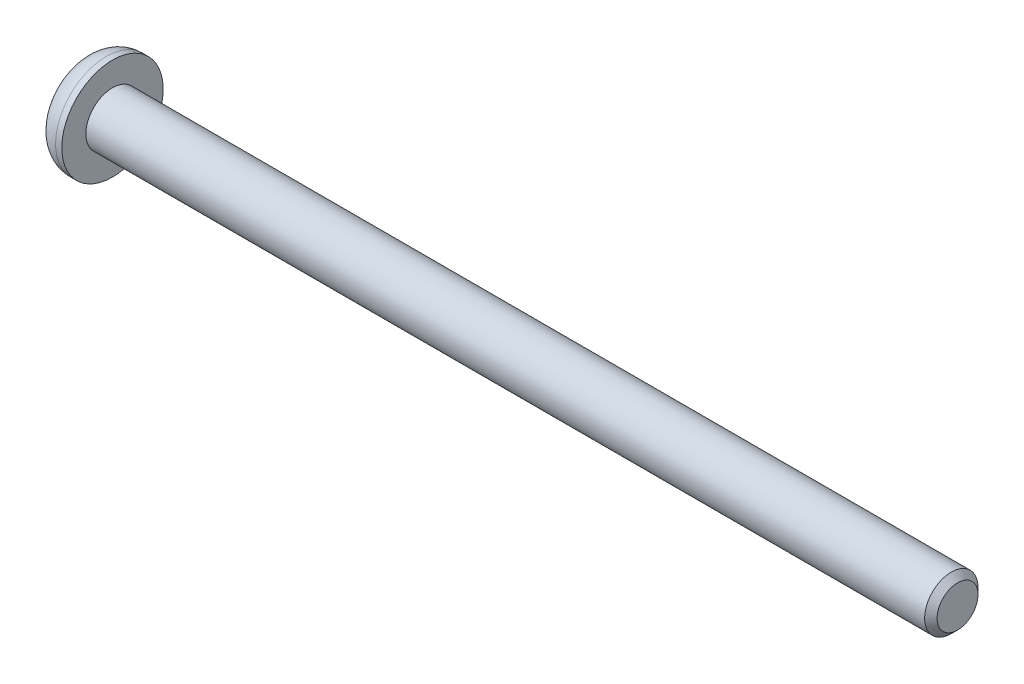
ISO-10303-21;
HEADER;
FILE_DESCRIPTION(('STEP AP214'),'2;1');
FILE_NAME('part.step','',(''),(''),'','','');
FILE_SCHEMA(('AUTOMOTIVE_DESIGN { 1 0 10303 214 1 1 1 1 }'));
ENDSEC;
DATA;
#1=APPLICATION_CONTEXT('core data for automotive mechanical design processes');
#2=APPLICATION_PROTOCOL_DEFINITION('international standard','automotive_design',2000,#1);
#3=PRODUCT_CONTEXT('',#1,'mechanical');
#4=PRODUCT('Part','Part','',(#3));
#5=PRODUCT_RELATED_PRODUCT_CATEGORY('part','',(#4));
#6=PRODUCT_DEFINITION_FORMATION('','',#4);
#7=PRODUCT_DEFINITION_CONTEXT('part definition',#1,'design');
#8=PRODUCT_DEFINITION('design','',#6,#7);
#9=PRODUCT_DEFINITION_SHAPE('','',#8);
#10=(LENGTH_UNIT() NAMED_UNIT(*) SI_UNIT(.MILLI.,.METRE.));
#11=(NAMED_UNIT(*) PLANE_ANGLE_UNIT() SI_UNIT($,.RADIAN.));
#12=(NAMED_UNIT(*) SI_UNIT($,.STERADIAN.) SOLID_ANGLE_UNIT());
#13=UNCERTAINTY_MEASURE_WITH_UNIT(LENGTH_MEASURE(1.E-05),#10,'distance_accuracy_value','');
#14=(GEOMETRIC_REPRESENTATION_CONTEXT(3) GLOBAL_UNCERTAINTY_ASSIGNED_CONTEXT((#13)) GLOBAL_UNIT_ASSIGNED_CONTEXT((#10,
#11,#12)) REPRESENTATION_CONTEXT('',''));
#15=CARTESIAN_POINT('',(0.,0.,0.));
#16=DIRECTION('',(0.,0.,1.));
#17=DIRECTION('',(1.,0.,0.));
#18=AXIS2_PLACEMENT_3D('',#15,#16,#17);
#19=CARTESIAN_POINT('',(0.,0.,0.));
#20=DIRECTION('',(1.,0.,0.));
#21=DIRECTION('',(0.,1.,0.));
#22=AXIS2_PLACEMENT_3D('',#19,#20,#21);
#23=PLANE('',#22);
#24=DIRECTION('',(0.,-0.5,-0.866025403784439));
#25=VECTOR('',#24,1.);
#26=CARTESIAN_POINT('',(0.,1.64544826719043,0.));
#27=LINE('',#26,#25);
#28=CARTESIAN_POINT('',(0.,1.64544826719043,0.));
#29=VERTEX_POINT('',#28);
#30=CARTESIAN_POINT('',(0.,0.822724133595217,-1.425));
#31=VERTEX_POINT('',#30);
#32=EDGE_CURVE('E138',#29,#31,#27,.T.);
#33=ORIENTED_EDGE('',*,*,#32,.F.);
#34=DIRECTION('',(0.,0.5,-0.866025403784439));
#35=VECTOR('',#34,1.);
#36=CARTESIAN_POINT('',(0.,0.822724133595217,1.425));
#37=LINE('',#36,#35);
#38=CARTESIAN_POINT('',(0.,0.822724133595217,1.425));
#39=VERTEX_POINT('',#38);
#40=EDGE_CURVE('E58',#39,#29,#37,.T.);
#41=ORIENTED_EDGE('',*,*,#40,.F.);
#42=DIRECTION('',(0.,1.,0.));
#43=VECTOR('',#42,1.);
#44=CARTESIAN_POINT('',(0.,-0.822724133595218,1.425));
#45=LINE('',#44,#43);
#46=CARTESIAN_POINT('',(0.,-0.822724133595218,1.425));
#47=VERTEX_POINT('',#46);
#48=EDGE_CURVE('E151',#47,#39,#45,.T.);
#49=ORIENTED_EDGE('',*,*,#48,.F.);
#50=DIRECTION('',(0.,0.5,0.866025403784439));
#51=VECTOR('',#50,1.);
#52=CARTESIAN_POINT('',(0.,-1.64544826719043,0.));
#53=LINE('',#52,#51);
#54=CARTESIAN_POINT('',(0.,-1.64544826719043,0.));
#55=VERTEX_POINT('',#54);
#56=EDGE_CURVE('E148',#55,#47,#53,.T.);
#57=ORIENTED_EDGE('',*,*,#56,.F.);
#58=DIRECTION('',(0.,-0.5,0.866025403784438));
#59=VECTOR('',#58,1.);
#60=CARTESIAN_POINT('',(0.,-0.822724133595217,-1.425));
#61=LINE('',#60,#59);
#62=CARTESIAN_POINT('',(0.,-0.822724133595217,-1.425));
#63=VERTEX_POINT('',#62);
#64=EDGE_CURVE('E106',#63,#55,#61,.T.);
#65=ORIENTED_EDGE('',*,*,#64,.F.);
#66=DIRECTION('',(0.,-1.,0.));
#67=VECTOR('',#66,1.);
#68=CARTESIAN_POINT('',(0.,0.822724133595217,-1.425));
#69=LINE('',#68,#67);
#70=EDGE_CURVE('E142',#31,#63,#69,.T.);
#71=ORIENTED_EDGE('',*,*,#70,.F.);
#72=EDGE_LOOP('',(#33,#41,#49,#57,#65,#71));
#73=FACE_BOUND('',#72,.T.);
#74=CARTESIAN_POINT('',(0.,0.,0.));
#75=DIRECTION('',(-1.,0.,0.));
#76=DIRECTION('',(0.,-1.,0.));
#77=AXIS2_PLACEMENT_3D('',#74,#75,#76);
#78=CIRCLE('',#77,2.85);
#79=CARTESIAN_POINT('',(0.,-2.85,0.));
#80=VERTEX_POINT('',#79);
#81=EDGE_CURVE('E157',#80,#80,#78,.T.);
#82=ORIENTED_EDGE('',*,*,#81,.T.);
#83=EDGE_LOOP('',(#82));
#84=FACE_BOUND('',#83,.T.);
#85=ADVANCED_FACE('F41',(#73,#84),#23,.F.);
#86=CARTESIAN_POINT('',(98.3,3.00000000000002,0.));
#87=DIRECTION('',(-1.,0.,0.));
#88=DIRECTION('',(0.,-1.,0.));
#89=AXIS2_PLACEMENT_3D('',#86,#87,#88);
#90=PLANE('',#89);
#91=CARTESIAN_POINT('',(98.3,0.,0.));
#92=DIRECTION('',(-1.,0.,0.));
#93=DIRECTION('',(0.,-1.,0.));
#94=AXIS2_PLACEMENT_3D('',#91,#92,#93);
#95=CIRCLE('',#94,2.29999999999998);
#96=CARTESIAN_POINT('',(98.3,-2.29999999999997,0.));
#97=VERTEX_POINT('',#96);
#98=EDGE_CURVE('E11',#97,#97,#95,.F.);
#99=ORIENTED_EDGE('',*,*,#98,.T.);
#100=EDGE_LOOP('',(#99));
#101=FACE_BOUND('',#100,.T.);
#102=ADVANCED_FACE('F203',(#101),#90,.F.);
#103=CARTESIAN_POINT('',(0.,0.,0.));
#104=DIRECTION('',(-1.,0.,0.));
#105=DIRECTION('',(0.,-1.,0.));
#106=AXIS2_PLACEMENT_3D('',#103,#104,#105);
#107=CYLINDRICAL_SURFACE('',#106,3.);
#108=CARTESIAN_POINT('',(97.6,0.,0.));
#109=DIRECTION('',(-1.,0.,0.));
#110=DIRECTION('',(0.,-1.,0.));
#111=AXIS2_PLACEMENT_3D('',#108,#109,#110);
#112=CIRCLE('',#111,3.);
#113=CARTESIAN_POINT('',(97.6,-2.99999999999998,0.));
#114=VERTEX_POINT('',#113);
#115=EDGE_CURVE('E51',#114,#114,#112,.T.);
#116=ORIENTED_EDGE('',*,*,#115,.T.);
#117=EDGE_LOOP('',(#116));
#118=FACE_BOUND('',#117,.T.);
#119=CARTESIAN_POINT('',(3.3,0.,0.));
#120=DIRECTION('',(-1.,0.,0.));
#121=DIRECTION('',(0.,-1.,0.));
#122=AXIS2_PLACEMENT_3D('',#119,#120,#121);
#123=CIRCLE('',#122,3.);
#124=CARTESIAN_POINT('',(3.3,-3.,0.));
#125=VERTEX_POINT('',#124);
#126=EDGE_CURVE('E178',#125,#125,#123,.T.);
#127=ORIENTED_EDGE('',*,*,#126,.F.);
#128=EDGE_LOOP('',(#127));
#129=FACE_BOUND('',#128,.T.);
#130=ADVANCED_FACE('F185',(#118,#129),#107,.T.);
#131=CARTESIAN_POINT('',(3.3,5.7,0.));
#132=DIRECTION('',(-1.,0.,0.));
#133=DIRECTION('',(0.,-1.,0.));
#134=AXIS2_PLACEMENT_3D('',#131,#132,#133);
#135=PLANE('',#134);
#136=CARTESIAN_POINT('',(3.3,0.,0.));
#137=DIRECTION('',(-1.,0.,0.));
#138=DIRECTION('',(0.,-1.,0.));
#139=AXIS2_PLACEMENT_3D('',#136,#137,#138);
#140=CIRCLE('',#139,5.7);
#141=CARTESIAN_POINT('',(3.3,-5.7,0.));
#142=VERTEX_POINT('',#141);
#143=EDGE_CURVE('E174',#142,#142,#140,.T.);
#144=ORIENTED_EDGE('',*,*,#143,.F.);
#145=EDGE_LOOP('',(#144));
#146=FACE_BOUND('',#145,.T.);
#147=ORIENTED_EDGE('',*,*,#126,.T.);
#148=EDGE_LOOP('',(#147));
#149=FACE_BOUND('',#148,.T.);
#150=ADVANCED_FACE('F215',(#146,#149),#135,.F.);
#151=CARTESIAN_POINT('',(0.,0.,0.));
#152=DIRECTION('',(-1.,0.,0.));
#153=DIRECTION('',(0.,-1.,0.));
#154=AXIS2_PLACEMENT_3D('',#151,#152,#153);
#155=CYLINDRICAL_SURFACE('',#154,5.7);
#156=CARTESIAN_POINT('',(2.6,0.,0.));
#157=DIRECTION('',(-1.,0.,0.));
#158=DIRECTION('',(0.,-1.,0.));
#159=AXIS2_PLACEMENT_3D('',#156,#157,#158);
#160=CIRCLE('',#159,5.7);
#161=CARTESIAN_POINT('',(2.6,-5.7,0.));
#162=VERTEX_POINT('',#161);
#163=EDGE_CURVE('E170',#162,#162,#160,.T.);
#164=ORIENTED_EDGE('',*,*,#163,.F.);
#165=EDGE_LOOP('',(#164));
#166=FACE_BOUND('',#165,.T.);
#167=ORIENTED_EDGE('',*,*,#143,.T.);
#168=EDGE_LOOP('',(#167));
#169=FACE_BOUND('',#168,.T.);
#170=ADVANCED_FACE('F198',(#166,#169),#155,.T.);
#171=CARTESIAN_POINT('',(2.6,0.,0.));
#172=DIRECTION('',(-1.,0.,0.));
#173=DIRECTION('',(0.,-1.,0.));
#174=AXIS2_PLACEMENT_3D('',#171,#172,#173);
#175=TOROIDAL_SURFACE('',#174,3.08903508771929,2.6109649122807);
#176=ORIENTED_EDGE('',*,*,#81,.F.);
#177=EDGE_LOOP('',(#176));
#178=FACE_BOUND('',#177,.T.);
#179=ORIENTED_EDGE('',*,*,#163,.T.);
#180=EDGE_LOOP('',(#179));
#181=FACE_BOUND('',#180,.T.);
#182=ADVANCED_FACE('F190',(#178,#181),#175,.T.);
#183=CARTESIAN_POINT('',(97.6,0.,0.));
#184=DIRECTION('',(-1.,0.,0.));
#185=DIRECTION('',(0.,-1.,0.));
#186=AXIS2_PLACEMENT_3D('',#183,#184,#185);
#187=CONICAL_SURFACE('',#186,3.,0.785398163397436);
#188=ORIENTED_EDGE('',*,*,#98,.F.);
#189=EDGE_LOOP('',(#188));
#190=FACE_BOUND('',#189,.T.);
#191=ORIENTED_EDGE('',*,*,#115,.F.);
#192=EDGE_LOOP('',(#191));
#193=FACE_BOUND('',#192,.T.);
#194=ADVANCED_FACE('F44',(#190,#193),#187,.T.);
#195=CARTESIAN_POINT('',(1.5,0.822724133595217,1.425));
#196=DIRECTION('',(0.,0.866025403784439,0.5));
#197=DIRECTION('',(0.,-0.5,0.866025403784439));
#198=AXIS2_PLACEMENT_3D('',#195,#196,#197);
#199=PLANE('',#198);
#200=ORIENTED_EDGE('',*,*,#40,.T.);
#201=DIRECTION('',(-1.,0.,0.));
#202=VECTOR('',#201,1.);
#203=CARTESIAN_POINT('',(1.5,1.64544826719043,0.));
#204=LINE('',#203,#202);
#205=CARTESIAN_POINT('',(1.5,1.64544826719043,0.));
#206=VERTEX_POINT('',#205);
#207=EDGE_CURVE('E88',#206,#29,#204,.T.);
#208=ORIENTED_EDGE('',*,*,#207,.F.);
#209=DIRECTION('',(0.,0.5,-0.866025403784439));
#210=VECTOR('',#209,1.);
#211=CARTESIAN_POINT('',(1.5,0.822724133595217,1.425));
#212=LINE('',#211,#210);
#213=CARTESIAN_POINT('',(1.5,0.822724133595217,1.425));
#214=VERTEX_POINT('',#213);
#215=EDGE_CURVE('E154',#214,#206,#212,.T.);
#216=ORIENTED_EDGE('',*,*,#215,.F.);
#217=DIRECTION('',(-1.,0.,0.));
#218=VECTOR('',#217,1.);
#219=CARTESIAN_POINT('',(1.5,0.822724133595217,1.425));
#220=LINE('',#219,#218);
#221=EDGE_CURVE('E66',#214,#39,#220,.T.);
#222=ORIENTED_EDGE('',*,*,#221,.T.);
#223=EDGE_LOOP('',(#200,#208,#216,#222));
#224=FACE_BOUND('',#223,.T.);
#225=ADVANCED_FACE('F189',(#224),#199,.F.);
#226=CARTESIAN_POINT('',(1.5,-0.822724133595217,1.425));
#227=DIRECTION('',(0.,0.,1.));
#228=DIRECTION('',(0.,-1.,0.));
#229=AXIS2_PLACEMENT_3D('',#226,#227,#228);
#230=PLANE('',#229);
#231=ORIENTED_EDGE('',*,*,#48,.T.);
#232=ORIENTED_EDGE('',*,*,#221,.F.);
#233=DIRECTION('',(0.,1.,0.));
#234=VECTOR('',#233,1.);
#235=CARTESIAN_POINT('',(1.5,-0.822724133595217,1.425));
#236=LINE('',#235,#234);
#237=CARTESIAN_POINT('',(1.5,-0.822724133595217,1.425));
#238=VERTEX_POINT('',#237);
#239=EDGE_CURVE('E120',#238,#214,#236,.T.);
#240=ORIENTED_EDGE('',*,*,#239,.F.);
#241=DIRECTION('',(-1.,0.,0.));
#242=VECTOR('',#241,1.);
#243=CARTESIAN_POINT('',(1.5,-0.822724133595217,1.425));
#244=LINE('',#243,#242);
#245=EDGE_CURVE('E111',#238,#47,#244,.T.);
#246=ORIENTED_EDGE('',*,*,#245,.T.);
#247=EDGE_LOOP('',(#231,#232,#240,#246));
#248=FACE_BOUND('',#247,.T.);
#249=ADVANCED_FACE('F196',(#248),#230,.F.);
#250=CARTESIAN_POINT('',(1.5,-1.64544826719043,0.));
#251=DIRECTION('',(0.,-0.866025403784439,0.5));
#252=DIRECTION('',(0.,-0.5,-0.866025403784439));
#253=AXIS2_PLACEMENT_3D('',#250,#251,#252);
#254=PLANE('',#253);
#255=ORIENTED_EDGE('',*,*,#56,.T.);
#256=ORIENTED_EDGE('',*,*,#245,.F.);
#257=DIRECTION('',(0.,0.5,0.866025403784439));
#258=VECTOR('',#257,1.);
#259=CARTESIAN_POINT('',(1.5,-1.64544826719043,0.));
#260=LINE('',#259,#258);
#261=CARTESIAN_POINT('',(1.5,-1.64544826719043,0.));
#262=VERTEX_POINT('',#261);
#263=EDGE_CURVE('E115',#262,#238,#260,.T.);
#264=ORIENTED_EDGE('',*,*,#263,.F.);
#265=DIRECTION('',(-1.,0.,0.));
#266=VECTOR('',#265,1.);
#267=CARTESIAN_POINT('',(1.5,-1.64544826719043,0.));
#268=LINE('',#267,#266);
#269=EDGE_CURVE('E99',#262,#55,#268,.T.);
#270=ORIENTED_EDGE('',*,*,#269,.T.);
#271=EDGE_LOOP('',(#255,#256,#264,#270));
#272=FACE_BOUND('',#271,.T.);
#273=ADVANCED_FACE('F116',(#272),#254,.F.);
#274=CARTESIAN_POINT('',(1.5,-0.822724133595217,-1.425));
#275=DIRECTION('',(0.,-0.866025403784439,-0.5));
#276=DIRECTION('',(0.,0.5,-0.866025403784439));
#277=AXIS2_PLACEMENT_3D('',#274,#275,#276);
#278=PLANE('',#277);
#279=ORIENTED_EDGE('',*,*,#64,.T.);
#280=ORIENTED_EDGE('',*,*,#269,.F.);
#281=DIRECTION('',(0.,-0.5,0.866025403784438));
#282=VECTOR('',#281,1.);
#283=CARTESIAN_POINT('',(1.5,-0.822724133595217,-1.425));
#284=LINE('',#283,#282);
#285=CARTESIAN_POINT('',(1.5,-0.822724133595217,-1.425));
#286=VERTEX_POINT('',#285);
#287=EDGE_CURVE('E103',#286,#262,#284,.T.);
#288=ORIENTED_EDGE('',*,*,#287,.F.);
#289=DIRECTION('',(-1.,0.,0.));
#290=VECTOR('',#289,1.);
#291=CARTESIAN_POINT('',(1.5,-0.822724133595217,-1.425));
#292=LINE('',#291,#290);
#293=EDGE_CURVE('E112',#286,#63,#292,.T.);
#294=ORIENTED_EDGE('',*,*,#293,.T.);
#295=EDGE_LOOP('',(#279,#280,#288,#294));
#296=FACE_BOUND('',#295,.T.);
#297=ADVANCED_FACE('F101',(#296),#278,.F.);
#298=CARTESIAN_POINT('',(1.5,0.822724133595218,-1.425));
#299=DIRECTION('',(0.,0.,-1.));
#300=DIRECTION('',(-1.,0.,0.));
#301=AXIS2_PLACEMENT_3D('',#298,#299,#300);
#302=PLANE('',#301);
#303=ORIENTED_EDGE('',*,*,#70,.T.);
#304=ORIENTED_EDGE('',*,*,#293,.F.);
#305=DIRECTION('',(0.,-1.,0.));
#306=VECTOR('',#305,1.);
#307=CARTESIAN_POINT('',(1.5,0.822724133595218,-1.425));
#308=LINE('',#307,#306);
#309=CARTESIAN_POINT('',(1.5,0.822724133595218,-1.425));
#310=VERTEX_POINT('',#309);
#311=EDGE_CURVE('E126',#310,#286,#308,.T.);
#312=ORIENTED_EDGE('',*,*,#311,.F.);
#313=DIRECTION('',(-1.,0.,0.));
#314=VECTOR('',#313,1.);
#315=CARTESIAN_POINT('',(1.5,0.822724133595218,-1.425));
#316=LINE('',#315,#314);
#317=EDGE_CURVE('E162',#310,#31,#316,.T.);
#318=ORIENTED_EDGE('',*,*,#317,.T.);
#319=EDGE_LOOP('',(#303,#304,#312,#318));
#320=FACE_BOUND('',#319,.T.);
#321=ADVANCED_FACE('F225',(#320),#302,.F.);
#322=CARTESIAN_POINT('',(1.5,1.64544826719043,0.));
#323=DIRECTION('',(0.,0.866025403784439,-0.5));
#324=DIRECTION('',(0.,0.5,0.866025403784439));
#325=AXIS2_PLACEMENT_3D('',#322,#323,#324);
#326=PLANE('',#325);
#327=ORIENTED_EDGE('',*,*,#32,.T.);
#328=ORIENTED_EDGE('',*,*,#317,.F.);
#329=DIRECTION('',(0.,-0.5,-0.866025403784439));
#330=VECTOR('',#329,1.);
#331=CARTESIAN_POINT('',(1.5,1.64544826719043,0.));
#332=LINE('',#331,#330);
#333=EDGE_CURVE('E130',#206,#310,#332,.T.);
#334=ORIENTED_EDGE('',*,*,#333,.F.);
#335=ORIENTED_EDGE('',*,*,#207,.T.);
#336=EDGE_LOOP('',(#327,#328,#334,#335));
#337=FACE_BOUND('',#336,.T.);
#338=ADVANCED_FACE('F222',(#337),#326,.F.);
#339=CARTESIAN_POINT('',(1.5,0.,0.));
#340=DIRECTION('',(-1.,0.,0.));
#341=DIRECTION('',(0.,-1.,0.));
#342=AXIS2_PLACEMENT_3D('',#339,#340,#341);
#343=PLANE('',#342);
#344=ORIENTED_EDGE('',*,*,#215,.T.);
#345=ORIENTED_EDGE('',*,*,#333,.T.);
#346=ORIENTED_EDGE('',*,*,#311,.T.);
#347=ORIENTED_EDGE('',*,*,#287,.T.);
#348=ORIENTED_EDGE('',*,*,#263,.T.);
#349=ORIENTED_EDGE('',*,*,#239,.T.);
#350=EDGE_LOOP('',(#344,#345,#346,#347,#348,#349));
#351=FACE_BOUND('',#350,.T.);
#352=ADVANCED_FACE('F123',(#351),#343,.T.);
#353=CLOSED_SHELL('',(#85,#102,#130,#150,#170,#182,#194,#225,#249,#273,#297,#321,#338,#352));
#354=MANIFOLD_SOLID_BREP('B2',#353);
#355=ADVANCED_BREP_SHAPE_REPRESENTATION('',(#18,#354),#14);
#356=SHAPE_DEFINITION_REPRESENTATION(#9,#355);
ENDSEC;
END-ISO-10303-21;
